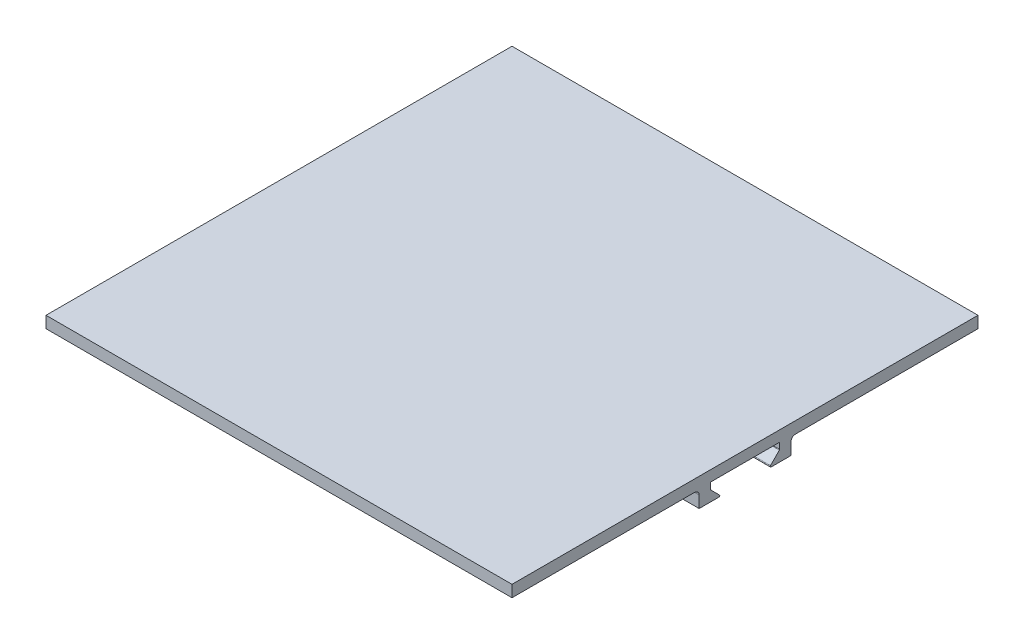
ISO-10303-21;
HEADER;
FILE_DESCRIPTION(('STEP AP214'),'2;1');
FILE_NAME('part.step','',(''),(''),'','','');
FILE_SCHEMA(('AUTOMOTIVE_DESIGN { 1 0 10303 214 1 1 1 1 }'));
ENDSEC;
DATA;
#1=APPLICATION_CONTEXT('core data for automotive mechanical design processes');
#2=APPLICATION_PROTOCOL_DEFINITION('international standard','automotive_design',2000,#1);
#3=PRODUCT_CONTEXT('',#1,'mechanical');
#4=PRODUCT('Part','Part','',(#3));
#5=PRODUCT_RELATED_PRODUCT_CATEGORY('part','',(#4));
#6=PRODUCT_DEFINITION_FORMATION('','',#4);
#7=PRODUCT_DEFINITION_CONTEXT('part definition',#1,'design');
#8=PRODUCT_DEFINITION('design','',#6,#7);
#9=PRODUCT_DEFINITION_SHAPE('','',#8);
#10=(LENGTH_UNIT() NAMED_UNIT(*) SI_UNIT(.MILLI.,.METRE.));
#11=(NAMED_UNIT(*) PLANE_ANGLE_UNIT() SI_UNIT($,.RADIAN.));
#12=(NAMED_UNIT(*) SI_UNIT($,.STERADIAN.) SOLID_ANGLE_UNIT());
#13=UNCERTAINTY_MEASURE_WITH_UNIT(LENGTH_MEASURE(1.E-05),#10,'distance_accuracy_value','');
#14=(GEOMETRIC_REPRESENTATION_CONTEXT(3) GLOBAL_UNCERTAINTY_ASSIGNED_CONTEXT((#13)) GLOBAL_UNIT_ASSIGNED_CONTEXT((#10,
#11,#12)) REPRESENTATION_CONTEXT('',''));
#15=CARTESIAN_POINT('',(0.,0.,0.));
#16=DIRECTION('',(0.,0.,1.));
#17=DIRECTION('',(1.,0.,0.));
#18=AXIS2_PLACEMENT_3D('',#15,#16,#17);
#19=CARTESIAN_POINT('',(127.,6.35,-127.));
#20=DIRECTION('',(-1.,0.,0.));
#21=DIRECTION('',(0.,0.,1.));
#22=AXIS2_PLACEMENT_3D('',#19,#20,#21);
#23=PLANE('',#22);
#24=DIRECTION('',(0.,0.,-1.));
#25=VECTOR('',#24,1.);
#26=CARTESIAN_POINT('',(127.,-8.89,25.));
#27=LINE('',#26,#25);
#28=CARTESIAN_POINT('',(127.,-8.89,25.));
#29=VERTEX_POINT('',#28);
#30=CARTESIAN_POINT('',(127.,-8.89,14.2546810586205));
#31=VERTEX_POINT('',#30);
#32=EDGE_CURVE('E218',#29,#31,#27,.T.);
#33=ORIENTED_EDGE('',*,*,#32,.T.);
#34=CARTESIAN_POINT('',(127.,-8.39,14.2546810586205));
#35=DIRECTION('',(-1.,0.,0.));
#36=DIRECTION('',(0.,0.,1.));
#37=AXIS2_PLACEMENT_3D('',#34,#35,#36);
#38=CIRCLE('',#37,0.5);
#39=CARTESIAN_POINT('',(127.,-8.03644660940672,13.9011276680272));
#40=VERTEX_POINT('',#39);
#41=EDGE_CURVE('E313',#31,#40,#38,.F.);
#42=ORIENTED_EDGE('',*,*,#41,.T.);
#43=DIRECTION('',(0.,-0.707106781186547,-0.707106781186548));
#44=VECTOR('',#43,1.);
#45=CARTESIAN_POINT('',(127.,-71.293787138717,-49.3562128612831));
#46=LINE('',#45,#44);
#47=CARTESIAN_POINT('',(127.,-3.19426197667087,18.7433123007631));
#48=VERTEX_POINT('',#47);
#49=EDGE_CURVE('E201',#48,#40,#46,.T.);
#50=ORIENTED_EDGE('',*,*,#49,.F.);
#51=CARTESIAN_POINT('',(127.,-2.84070858607759,18.3897589101698));
#52=DIRECTION('',(-1.,0.,0.));
#53=DIRECTION('',(0.,0.,1.));
#54=AXIS2_PLACEMENT_3D('',#51,#52,#53);
#55=CIRCLE('',#54,0.5);
#56=CARTESIAN_POINT('',(127.,-2.84070858607759,18.8897589101698));
#57=VERTEX_POINT('',#56);
#58=EDGE_CURVE('E295',#48,#57,#55,.T.);
#59=ORIENTED_EDGE('',*,*,#58,.T.);
#60=DIRECTION('',(0.,-1.,0.));
#61=VECTOR('',#60,1.);
#62=CARTESIAN_POINT('',(127.,6.35,18.8897589101698));
#63=LINE('',#62,#61);
#64=CARTESIAN_POINT('',(127.,0.491000000000111,18.8897589101698));
#65=VERTEX_POINT('',#64);
#66=EDGE_CURVE('E204',#65,#57,#63,.T.);
#67=ORIENTED_EDGE('',*,*,#66,.F.);
#68=DIRECTION('',(0.,0.,1.));
#69=VECTOR('',#68,1.);
#70=CARTESIAN_POINT('',(127.,0.49100000000011,-127.));
#71=LINE('',#70,#69);
#72=CARTESIAN_POINT('',(127.,0.491000000000111,-18.8722410898302));
#73=VERTEX_POINT('',#72);
#74=EDGE_CURVE('E175',#73,#65,#71,.T.);
#75=ORIENTED_EDGE('',*,*,#74,.F.);
#76=DIRECTION('',(0.,-1.,0.));
#77=VECTOR('',#76,1.);
#78=CARTESIAN_POINT('',(127.,6.35,-18.8722410898302));
#79=LINE('',#78,#77);
#80=CARTESIAN_POINT('',(127.,-2.84070858607759,-18.8722410898302));
#81=VERTEX_POINT('',#80);
#82=EDGE_CURVE('E207',#73,#81,#79,.T.);
#83=ORIENTED_EDGE('',*,*,#82,.T.);
#84=CARTESIAN_POINT('',(127.,-2.84070858607759,-18.3722410898302));
#85=DIRECTION('',(-1.,0.,0.));
#86=DIRECTION('',(0.,0.,1.));
#87=AXIS2_PLACEMENT_3D('',#84,#85,#86);
#88=CIRCLE('',#87,0.5);
#89=CARTESIAN_POINT('',(127.,-3.19426197667087,-18.7257944804235));
#90=VERTEX_POINT('',#89);
#91=EDGE_CURVE('E290',#81,#90,#88,.T.);
#92=ORIENTED_EDGE('',*,*,#91,.T.);
#93=DIRECTION('',(0.,-0.707106781186548,0.707106781186548));
#94=VECTOR('',#93,1.);
#95=CARTESIAN_POINT('',(127.,55.7149717714528,-77.6350282285472));
#96=LINE('',#95,#94);
#97=CARTESIAN_POINT('',(127.,-8.03644660940673,-13.8836098476876));
#98=VERTEX_POINT('',#97);
#99=EDGE_CURVE('E197',#90,#98,#96,.T.);
#100=ORIENTED_EDGE('',*,*,#99,.T.);
#101=CARTESIAN_POINT('',(127.,-8.39,-14.2371632382809));
#102=DIRECTION('',(-1.,0.,0.));
#103=DIRECTION('',(0.,0.,1.));
#104=AXIS2_PLACEMENT_3D('',#101,#102,#103);
#105=CIRCLE('',#104,0.5);
#106=CARTESIAN_POINT('',(127.,-8.89,-14.2371632382809));
#107=VERTEX_POINT('',#106);
#108=EDGE_CURVE('E315',#98,#107,#105,.F.);
#109=ORIENTED_EDGE('',*,*,#108,.T.);
#110=CARTESIAN_POINT('',(127.,-8.89,-25.));
#111=VERTEX_POINT('',#110);
#112=EDGE_CURVE('E217',#107,#111,#27,.T.);
#113=ORIENTED_EDGE('',*,*,#112,.T.);
#114=DIRECTION('',(0.,1.,0.));
#115=VECTOR('',#114,1.);
#116=CARTESIAN_POINT('',(127.,-8.89,-25.));
#117=LINE('',#116,#115);
#118=CARTESIAN_POINT('',(127.,-2.54,-25.));
#119=VERTEX_POINT('',#118);
#120=EDGE_CURVE('E255',#111,#119,#117,.T.);
#121=ORIENTED_EDGE('',*,*,#120,.T.);
#122=CARTESIAN_POINT('',(127.,-2.54,-27.54));
#123=DIRECTION('',(-1.,0.,0.));
#124=DIRECTION('',(0.,0.,1.));
#125=AXIS2_PLACEMENT_3D('',#122,#123,#124);
#126=CIRCLE('',#125,2.54);
#127=CARTESIAN_POINT('',(127.,0.,-27.54));
#128=VERTEX_POINT('',#127);
#129=EDGE_CURVE('E268',#119,#128,#126,.T.);
#130=ORIENTED_EDGE('',*,*,#129,.T.);
#131=DIRECTION('',(0.,0.,-1.));
#132=VECTOR('',#131,1.);
#133=CARTESIAN_POINT('',(127.,0.,-127.));
#134=LINE('',#133,#132);
#135=CARTESIAN_POINT('',(127.,0.,-127.));
#136=VERTEX_POINT('',#135);
#137=EDGE_CURVE('E242',#128,#136,#134,.T.);
#138=ORIENTED_EDGE('',*,*,#137,.T.);
#139=DIRECTION('',(0.,-1.,0.));
#140=VECTOR('',#139,1.);
#141=CARTESIAN_POINT('',(127.,6.35,-127.));
#142=LINE('',#141,#140);
#143=CARTESIAN_POINT('',(127.,6.35,-127.));
#144=VERTEX_POINT('',#143);
#145=EDGE_CURVE('E249',#144,#136,#142,.T.);
#146=ORIENTED_EDGE('',*,*,#145,.F.);
#147=DIRECTION('',(0.,0.,-1.));
#148=VECTOR('',#147,1.);
#149=CARTESIAN_POINT('',(127.,6.35,-127.));
#150=LINE('',#149,#148);
#151=CARTESIAN_POINT('',(127.,6.35,127.));
#152=VERTEX_POINT('',#151);
#153=EDGE_CURVE('E225',#152,#144,#150,.T.);
#154=ORIENTED_EDGE('',*,*,#153,.F.);
#155=DIRECTION('',(0.,-1.,0.));
#156=VECTOR('',#155,1.);
#157=CARTESIAN_POINT('',(127.,6.35,127.));
#158=LINE('',#157,#156);
#159=CARTESIAN_POINT('',(127.,0.,127.));
#160=VERTEX_POINT('',#159);
#161=EDGE_CURVE('E235',#152,#160,#158,.T.);
#162=ORIENTED_EDGE('',*,*,#161,.T.);
#163=CARTESIAN_POINT('',(127.,0.,27.54));
#164=VERTEX_POINT('',#163);
#165=EDGE_CURVE('E246',#160,#164,#134,.T.);
#166=ORIENTED_EDGE('',*,*,#165,.T.);
#167=CARTESIAN_POINT('',(127.,-2.54,27.54));
#168=DIRECTION('',(-1.,0.,0.));
#169=DIRECTION('',(0.,0.,1.));
#170=AXIS2_PLACEMENT_3D('',#167,#168,#169);
#171=CIRCLE('',#170,2.54);
#172=CARTESIAN_POINT('',(127.,-2.54,25.));
#173=VERTEX_POINT('',#172);
#174=EDGE_CURVE('E40',#164,#173,#171,.T.);
#175=ORIENTED_EDGE('',*,*,#174,.T.);
#176=DIRECTION('',(0.,1.,0.));
#177=VECTOR('',#176,1.);
#178=CARTESIAN_POINT('',(127.,-8.89,25.));
#179=LINE('',#178,#177);
#180=EDGE_CURVE('E327',#29,#173,#179,.T.);
#181=ORIENTED_EDGE('',*,*,#180,.F.);
#182=EDGE_LOOP('',(#33,#42,#50,#59,#67,#75,#83,#92,#100,#109,#113,#121,#130,#138,#146,#154,#162,
#166,#175,#181));
#183=FACE_BOUND('',#182,.T.);
#184=ADVANCED_FACE('F32',(#183),#23,.F.);
#185=CARTESIAN_POINT('',(-127.,6.35,-127.));
#186=DIRECTION('',(1.,0.,0.));
#187=DIRECTION('',(0.,0.,-1.));
#188=AXIS2_PLACEMENT_3D('',#185,#186,#187);
#189=PLANE('',#188);
#190=DIRECTION('',(0.,-0.707106781186547,-0.707106781186548));
#191=VECTOR('',#190,1.);
#192=CARTESIAN_POINT('',(-127.,-3.04781536726414,18.8897589101698));
#193=LINE('',#192,#191);
#194=CARTESIAN_POINT('',(-127.,-3.19426197667086,18.7433123007631));
#195=VERTEX_POINT('',#194);
#196=CARTESIAN_POINT('',(-127.,-8.03644660940673,13.9011276680272));
#197=VERTEX_POINT('',#196);
#198=EDGE_CURVE('E188',#195,#197,#193,.T.);
#199=ORIENTED_EDGE('',*,*,#198,.T.);
#200=CARTESIAN_POINT('',(-127.,-8.39,14.2546810586205));
#201=DIRECTION('',(1.,0.,0.));
#202=DIRECTION('',(0.,0.,-1.));
#203=AXIS2_PLACEMENT_3D('',#200,#201,#202);
#204=CIRCLE('',#203,0.5);
#205=CARTESIAN_POINT('',(-127.,-8.89,14.2546810586205));
#206=VERTEX_POINT('',#205);
#207=EDGE_CURVE('E309',#197,#206,#204,.F.);
#208=ORIENTED_EDGE('',*,*,#207,.T.);
#209=DIRECTION('',(0.,0.,-1.));
#210=VECTOR('',#209,1.);
#211=CARTESIAN_POINT('',(-127.,-8.89,25.));
#212=LINE('',#211,#210);
#213=CARTESIAN_POINT('',(-127.,-8.89,25.));
#214=VERTEX_POINT('',#213);
#215=EDGE_CURVE('E211',#214,#206,#212,.T.);
#216=ORIENTED_EDGE('',*,*,#215,.F.);
#217=DIRECTION('',(0.,1.,0.));
#218=VECTOR('',#217,1.);
#219=CARTESIAN_POINT('',(-127.,-8.89,25.));
#220=LINE('',#219,#218);
#221=CARTESIAN_POINT('',(-127.,-2.54,25.));
#222=VERTEX_POINT('',#221);
#223=EDGE_CURVE('E224',#214,#222,#220,.T.);
#224=ORIENTED_EDGE('',*,*,#223,.T.);
#225=CARTESIAN_POINT('',(-127.,-2.54,27.54));
#226=DIRECTION('',(1.,0.,0.));
#227=DIRECTION('',(0.,0.,-1.));
#228=AXIS2_PLACEMENT_3D('',#225,#226,#227);
#229=CIRCLE('',#228,2.54);
#230=CARTESIAN_POINT('',(-127.,0.,27.54));
#231=VERTEX_POINT('',#230);
#232=EDGE_CURVE('E11',#222,#231,#229,.T.);
#233=ORIENTED_EDGE('',*,*,#232,.T.);
#234=DIRECTION('',(0.,0.,1.));
#235=VECTOR('',#234,1.);
#236=CARTESIAN_POINT('',(-127.,0.,-127.));
#237=LINE('',#236,#235);
#238=CARTESIAN_POINT('',(-127.,0.,127.));
#239=VERTEX_POINT('',#238);
#240=EDGE_CURVE('E254',#231,#239,#237,.T.);
#241=ORIENTED_EDGE('',*,*,#240,.T.);
#242=DIRECTION('',(0.,-1.,0.));
#243=VECTOR('',#242,1.);
#244=CARTESIAN_POINT('',(-127.,6.35,127.));
#245=LINE('',#244,#243);
#246=CARTESIAN_POINT('',(-127.,6.35,127.));
#247=VERTEX_POINT('',#246);
#248=EDGE_CURVE('E350',#247,#239,#245,.T.);
#249=ORIENTED_EDGE('',*,*,#248,.F.);
#250=DIRECTION('',(0.,0.,1.));
#251=VECTOR('',#250,1.);
#252=CARTESIAN_POINT('',(-127.,6.35,-127.));
#253=LINE('',#252,#251);
#254=CARTESIAN_POINT('',(-127.,6.35,-127.));
#255=VERTEX_POINT('',#254);
#256=EDGE_CURVE('E231',#255,#247,#253,.T.);
#257=ORIENTED_EDGE('',*,*,#256,.F.);
#258=DIRECTION('',(0.,-1.,0.));
#259=VECTOR('',#258,1.);
#260=CARTESIAN_POINT('',(-127.,6.35,-127.));
#261=LINE('',#260,#259);
#262=CARTESIAN_POINT('',(-127.,0.,-127.));
#263=VERTEX_POINT('',#262);
#264=EDGE_CURVE('E352',#255,#263,#261,.T.);
#265=ORIENTED_EDGE('',*,*,#264,.T.);
#266=CARTESIAN_POINT('',(-127.,0.,-27.54));
#267=VERTEX_POINT('',#266);
#268=EDGE_CURVE('E251',#263,#267,#237,.T.);
#269=ORIENTED_EDGE('',*,*,#268,.T.);
#270=CARTESIAN_POINT('',(-127.,-2.54,-27.54));
#271=DIRECTION('',(1.,0.,0.));
#272=DIRECTION('',(0.,0.,-1.));
#273=AXIS2_PLACEMENT_3D('',#270,#271,#272);
#274=CIRCLE('',#273,2.54);
#275=CARTESIAN_POINT('',(-127.,-2.54,-25.));
#276=VERTEX_POINT('',#275);
#277=EDGE_CURVE('E270',#267,#276,#274,.T.);
#278=ORIENTED_EDGE('',*,*,#277,.T.);
#279=DIRECTION('',(0.,1.,0.));
#280=VECTOR('',#279,1.);
#281=CARTESIAN_POINT('',(-127.,-8.89,-25.));
#282=LINE('',#281,#280);
#283=CARTESIAN_POINT('',(-127.,-8.89,-25.));
#284=VERTEX_POINT('',#283);
#285=EDGE_CURVE('E275',#284,#276,#282,.T.);
#286=ORIENTED_EDGE('',*,*,#285,.F.);
#287=CARTESIAN_POINT('',(-127.,-8.89,-14.2371632382809));
#288=VERTEX_POINT('',#287);
#289=EDGE_CURVE('E210',#288,#284,#212,.T.);
#290=ORIENTED_EDGE('',*,*,#289,.F.);
#291=CARTESIAN_POINT('',(-127.,-8.39,-14.2371632382809));
#292=DIRECTION('',(1.,0.,0.));
#293=DIRECTION('',(0.,0.,-1.));
#294=AXIS2_PLACEMENT_3D('',#291,#292,#293);
#295=CIRCLE('',#294,0.5);
#296=CARTESIAN_POINT('',(-127.,-8.03644660940673,-13.8836098476876));
#297=VERTEX_POINT('',#296);
#298=EDGE_CURVE('E311',#288,#297,#295,.F.);
#299=ORIENTED_EDGE('',*,*,#298,.T.);
#300=DIRECTION('',(0.,-0.707106781186548,0.707106781186548));
#301=VECTOR('',#300,1.);
#302=CARTESIAN_POINT('',(-127.,-3.04781536726413,-18.8722410898302));
#303=LINE('',#302,#301);
#304=CARTESIAN_POINT('',(-127.,-3.19426197667086,-18.7257944804235));
#305=VERTEX_POINT('',#304);
#306=EDGE_CURVE('E568',#305,#297,#303,.T.);
#307=ORIENTED_EDGE('',*,*,#306,.F.);
#308=CARTESIAN_POINT('',(-127.,-2.84070858607759,-18.3722410898302));
#309=DIRECTION('',(1.,0.,0.));
#310=DIRECTION('',(0.,0.,-1.));
#311=AXIS2_PLACEMENT_3D('',#308,#309,#310);
#312=CIRCLE('',#311,0.5);
#313=CARTESIAN_POINT('',(-127.,-2.84070858607759,-18.8722410898302));
#314=VERTEX_POINT('',#313);
#315=EDGE_CURVE('E291',#305,#314,#312,.T.);
#316=ORIENTED_EDGE('',*,*,#315,.T.);
#317=DIRECTION('',(0.,-1.,0.));
#318=VECTOR('',#317,1.);
#319=CARTESIAN_POINT('',(-127.,0.491000000000111,-18.8722410898302));
#320=LINE('',#319,#318);
#321=CARTESIAN_POINT('',(-127.,0.491000000000111,-18.8722410898302));
#322=VERTEX_POINT('',#321);
#323=EDGE_CURVE('E193',#322,#314,#320,.T.);
#324=ORIENTED_EDGE('',*,*,#323,.F.);
#325=DIRECTION('',(0.,0.,1.));
#326=VECTOR('',#325,1.);
#327=CARTESIAN_POINT('',(-127.,0.491000000000111,-18.8722410898302));
#328=LINE('',#327,#326);
#329=CARTESIAN_POINT('',(-127.,0.491000000000111,18.8897589101698));
#330=VERTEX_POINT('',#329);
#331=EDGE_CURVE('E172',#322,#330,#328,.T.);
#332=ORIENTED_EDGE('',*,*,#331,.T.);
#333=DIRECTION('',(0.,-1.,0.));
#334=VECTOR('',#333,1.);
#335=CARTESIAN_POINT('',(-127.,0.491000000000111,18.8897589101698));
#336=LINE('',#335,#334);
#337=CARTESIAN_POINT('',(-127.,-2.84070858607759,18.8897589101698));
#338=VERTEX_POINT('',#337);
#339=EDGE_CURVE('E183',#330,#338,#336,.T.);
#340=ORIENTED_EDGE('',*,*,#339,.T.);
#341=CARTESIAN_POINT('',(-127.,-2.84070858607759,18.3897589101698));
#342=DIRECTION('',(1.,0.,0.));
#343=DIRECTION('',(0.,0.,-1.));
#344=AXIS2_PLACEMENT_3D('',#341,#342,#343);
#345=CIRCLE('',#344,0.5);
#346=EDGE_CURVE('E297',#338,#195,#345,.T.);
#347=ORIENTED_EDGE('',*,*,#346,.T.);
#348=EDGE_LOOP('',(#199,#208,#216,#224,#233,#241,#249,#257,#265,#269,#278,#286,#290,#299,#307,
#316,#324,#332,#340,#347));
#349=FACE_BOUND('',#348,.T.);
#350=ADVANCED_FACE('F191',(#349),#189,.F.);
#351=CARTESIAN_POINT('',(0.,-8.89,0.));
#352=DIRECTION('',(0.,-1.,0.));
#353=DIRECTION('',(0.,0.,-1.));
#354=AXIS2_PLACEMENT_3D('',#351,#352,#353);
#355=PLANE('',#354);
#356=ORIENTED_EDGE('',*,*,#215,.T.);
#357=DIRECTION('',(1.,0.,0.));
#358=VECTOR('',#357,1.);
#359=CARTESIAN_POINT('',(0.,-8.89,14.2546810586205));
#360=LINE('',#359,#358);
#361=EDGE_CURVE('E317',#206,#31,#360,.T.);
#362=ORIENTED_EDGE('',*,*,#361,.T.);
#363=ORIENTED_EDGE('',*,*,#32,.F.);
#364=DIRECTION('',(1.,0.,0.));
#365=VECTOR('',#364,1.);
#366=CARTESIAN_POINT('',(-127.,-8.89,25.));
#367=LINE('',#366,#365);
#368=EDGE_CURVE('E221',#214,#29,#367,.T.);
#369=ORIENTED_EDGE('',*,*,#368,.F.);
#370=EDGE_LOOP('',(#356,#362,#363,#369));
#371=FACE_BOUND('',#370,.T.);
#372=ADVANCED_FACE('F364',(#371),#355,.T.);
#373=CARTESIAN_POINT('',(0.,0.,0.));
#374=DIRECTION('',(0.,1.,0.));
#375=DIRECTION('',(0.,0.,1.));
#376=AXIS2_PLACEMENT_3D('',#373,#374,#375);
#377=PLANE('',#376);
#378=ORIENTED_EDGE('',*,*,#137,.F.);
#379=DIRECTION('',(1.,0.,0.));
#380=VECTOR('',#379,1.);
#381=CARTESIAN_POINT('',(-127.,0.,-27.54));
#382=LINE('',#381,#380);
#383=EDGE_CURVE('E263',#128,#267,#382,.F.);
#384=ORIENTED_EDGE('',*,*,#383,.T.);
#385=ORIENTED_EDGE('',*,*,#268,.F.);
#386=DIRECTION('',(-1.,0.,0.));
#387=VECTOR('',#386,1.);
#388=CARTESIAN_POINT('',(-127.,0.,-127.));
#389=LINE('',#388,#387);
#390=EDGE_CURVE('E238',#136,#263,#389,.T.);
#391=ORIENTED_EDGE('',*,*,#390,.F.);
#392=EDGE_LOOP('',(#378,#384,#385,#391));
#393=FACE_BOUND('',#392,.T.);
#394=ADVANCED_FACE('F362',(#393),#377,.F.);
#395=CARTESIAN_POINT('',(-127.,6.35,-127.));
#396=DIRECTION('',(0.,0.,1.));
#397=DIRECTION('',(1.,0.,0.));
#398=AXIS2_PLACEMENT_3D('',#395,#396,#397);
#399=PLANE('',#398);
#400=ORIENTED_EDGE('',*,*,#390,.T.);
#401=ORIENTED_EDGE('',*,*,#264,.F.);
#402=DIRECTION('',(-1.,0.,0.));
#403=VECTOR('',#402,1.);
#404=CARTESIAN_POINT('',(-127.,6.35,-127.));
#405=LINE('',#404,#403);
#406=EDGE_CURVE('E228',#144,#255,#405,.T.);
#407=ORIENTED_EDGE('',*,*,#406,.F.);
#408=ORIENTED_EDGE('',*,*,#145,.T.);
#409=EDGE_LOOP('',(#400,#401,#407,#408));
#410=FACE_BOUND('',#409,.T.);
#411=ADVANCED_FACE('F358',(#410),#399,.F.);
#412=CARTESIAN_POINT('',(-127.,6.35,127.));
#413=DIRECTION('',(0.,0.,-1.));
#414=DIRECTION('',(-1.,0.,0.));
#415=AXIS2_PLACEMENT_3D('',#412,#413,#414);
#416=PLANE('',#415);
#417=DIRECTION('',(1.,0.,0.));
#418=VECTOR('',#417,1.);
#419=CARTESIAN_POINT('',(-127.,0.,127.));
#420=LINE('',#419,#418);
#421=EDGE_CURVE('E229',#239,#160,#420,.T.);
#422=ORIENTED_EDGE('',*,*,#421,.T.);
#423=ORIENTED_EDGE('',*,*,#161,.F.);
#424=DIRECTION('',(1.,0.,0.));
#425=VECTOR('',#424,1.);
#426=CARTESIAN_POINT('',(-127.,6.35,127.));
#427=LINE('',#426,#425);
#428=EDGE_CURVE('E233',#247,#152,#427,.T.);
#429=ORIENTED_EDGE('',*,*,#428,.F.);
#430=ORIENTED_EDGE('',*,*,#248,.T.);
#431=EDGE_LOOP('',(#422,#423,#429,#430));
#432=FACE_BOUND('',#431,.T.);
#433=ADVANCED_FACE('F370',(#432),#416,.F.);
#434=CARTESIAN_POINT('',(0.,6.35,0.));
#435=DIRECTION('',(0.,1.,0.));
#436=DIRECTION('',(0.,0.,1.));
#437=AXIS2_PLACEMENT_3D('',#434,#435,#436);
#438=PLANE('',#437);
#439=ORIENTED_EDGE('',*,*,#153,.T.);
#440=ORIENTED_EDGE('',*,*,#406,.T.);
#441=ORIENTED_EDGE('',*,*,#256,.T.);
#442=ORIENTED_EDGE('',*,*,#428,.T.);
#443=EDGE_LOOP('',(#439,#440,#441,#442));
#444=FACE_BOUND('',#443,.T.);
#445=ADVANCED_FACE('F378',(#444),#438,.T.);
#446=ORIENTED_EDGE('',*,*,#240,.F.);
#447=DIRECTION('',(1.,0.,0.));
#448=VECTOR('',#447,1.);
#449=CARTESIAN_POINT('',(0.,0.,27.54));
#450=LINE('',#449,#448);
#451=EDGE_CURVE('E264',#231,#164,#450,.T.);
#452=ORIENTED_EDGE('',*,*,#451,.T.);
#453=ORIENTED_EDGE('',*,*,#165,.F.);
#454=ORIENTED_EDGE('',*,*,#421,.F.);
#455=EDGE_LOOP('',(#446,#452,#453,#454));
#456=FACE_BOUND('',#455,.T.);
#457=ADVANCED_FACE('F342',(#456),#377,.F.);
#458=CARTESIAN_POINT('',(-127.,-8.89,-25.));
#459=DIRECTION('',(0.,0.,1.));
#460=DIRECTION('',(1.,0.,0.));
#461=AXIS2_PLACEMENT_3D('',#458,#459,#460);
#462=PLANE('',#461);
#463=ORIENTED_EDGE('',*,*,#285,.T.);
#464=DIRECTION('',(1.,0.,0.));
#465=VECTOR('',#464,1.);
#466=CARTESIAN_POINT('',(127.,-2.54,-25.));
#467=LINE('',#466,#465);
#468=EDGE_CURVE('E286',#276,#119,#467,.T.);
#469=ORIENTED_EDGE('',*,*,#468,.T.);
#470=ORIENTED_EDGE('',*,*,#120,.F.);
#471=DIRECTION('',(1.,0.,0.));
#472=VECTOR('',#471,1.);
#473=CARTESIAN_POINT('',(-127.,-8.89,-25.));
#474=LINE('',#473,#472);
#475=EDGE_CURVE('E214',#284,#111,#474,.T.);
#476=ORIENTED_EDGE('',*,*,#475,.F.);
#477=EDGE_LOOP('',(#463,#469,#470,#476));
#478=FACE_BOUND('',#477,.T.);
#479=ADVANCED_FACE('F284',(#478),#462,.F.);
#480=CARTESIAN_POINT('',(-127.,-8.89,25.));
#481=DIRECTION('',(0.,0.,1.));
#482=DIRECTION('',(1.,0.,0.));
#483=AXIS2_PLACEMENT_3D('',#480,#481,#482);
#484=PLANE('',#483);
#485=ORIENTED_EDGE('',*,*,#180,.T.);
#486=DIRECTION('',(1.,0.,0.));
#487=VECTOR('',#486,1.);
#488=CARTESIAN_POINT('',(-127.,-2.54,25.));
#489=LINE('',#488,#487);
#490=EDGE_CURVE('E53',#173,#222,#489,.F.);
#491=ORIENTED_EDGE('',*,*,#490,.T.);
#492=ORIENTED_EDGE('',*,*,#223,.F.);
#493=ORIENTED_EDGE('',*,*,#368,.T.);
#494=EDGE_LOOP('',(#485,#491,#492,#493));
#495=FACE_BOUND('',#494,.T.);
#496=ADVANCED_FACE('F418',(#495),#484,.T.);
#497=ORIENTED_EDGE('',*,*,#112,.F.);
#498=DIRECTION('',(1.,0.,0.));
#499=VECTOR('',#498,1.);
#500=CARTESIAN_POINT('',(-127.,-8.89,-14.2371632382809));
#501=LINE('',#500,#499);
#502=EDGE_CURVE('E301',#107,#288,#501,.F.);
#503=ORIENTED_EDGE('',*,*,#502,.T.);
#504=ORIENTED_EDGE('',*,*,#289,.T.);
#505=ORIENTED_EDGE('',*,*,#475,.T.);
#506=EDGE_LOOP('',(#497,#503,#504,#505));
#507=FACE_BOUND('',#506,.T.);
#508=ADVANCED_FACE('F374',(#507),#355,.T.);
#509=CARTESIAN_POINT('',(127.00005,0.491000000000111,-18.8722410898302));
#510=DIRECTION('',(0.,0.,-1.));
#511=DIRECTION('',(-1.,0.,0.));
#512=AXIS2_PLACEMENT_3D('',#509,#510,#511);
#513=PLANE('',#512);
#514=ORIENTED_EDGE('',*,*,#323,.T.);
#515=DIRECTION('',(-1.,0.,0.));
#516=VECTOR('',#515,1.);
#517=CARTESIAN_POINT('',(127.,-2.84070858607759,-18.8722410898302));
#518=LINE('',#517,#516);
#519=EDGE_CURVE('E299',#314,#81,#518,.F.);
#520=ORIENTED_EDGE('',*,*,#519,.T.);
#521=ORIENTED_EDGE('',*,*,#82,.F.);
#522=DIRECTION('',(-1.,0.,0.));
#523=VECTOR('',#522,1.);
#524=CARTESIAN_POINT('',(127.00005,0.491000000000111,-18.8722410898302));
#525=LINE('',#524,#523);
#526=EDGE_CURVE('E179',#73,#322,#525,.T.);
#527=ORIENTED_EDGE('',*,*,#526,.T.);
#528=EDGE_LOOP('',(#514,#520,#521,#527));
#529=FACE_BOUND('',#528,.T.);
#530=ADVANCED_FACE('F514',(#529),#513,.F.);
#531=CARTESIAN_POINT('',(127.00005,0.491000000000111,-18.8722410898302));
#532=DIRECTION('',(0.,-1.,0.));
#533=DIRECTION('',(0.,0.,-1.));
#534=AXIS2_PLACEMENT_3D('',#531,#532,#533);
#535=PLANE('',#534);
#536=ORIENTED_EDGE('',*,*,#74,.T.);
#537=DIRECTION('',(-1.,0.,0.));
#538=VECTOR('',#537,1.);
#539=CARTESIAN_POINT('',(127.00005,0.491000000000111,18.8897589101698));
#540=LINE('',#539,#538);
#541=EDGE_CURVE('E167',#65,#330,#540,.T.);
#542=ORIENTED_EDGE('',*,*,#541,.T.);
#543=ORIENTED_EDGE('',*,*,#331,.F.);
#544=ORIENTED_EDGE('',*,*,#526,.F.);
#545=EDGE_LOOP('',(#536,#542,#543,#544));
#546=FACE_BOUND('',#545,.T.);
#547=ADVANCED_FACE('F169',(#546),#535,.T.);
#548=CARTESIAN_POINT('',(127.00005,0.491000000000111,18.8897589101698));
#549=DIRECTION('',(0.,0.,-1.));
#550=DIRECTION('',(-1.,0.,0.));
#551=AXIS2_PLACEMENT_3D('',#548,#549,#550);
#552=PLANE('',#551);
#553=ORIENTED_EDGE('',*,*,#66,.T.);
#554=DIRECTION('',(-1.,0.,0.));
#555=VECTOR('',#554,1.);
#556=CARTESIAN_POINT('',(-127.,-2.84070858607759,18.8897589101698));
#557=LINE('',#556,#555);
#558=EDGE_CURVE('E186',#57,#338,#557,.T.);
#559=ORIENTED_EDGE('',*,*,#558,.T.);
#560=ORIENTED_EDGE('',*,*,#339,.F.);
#561=ORIENTED_EDGE('',*,*,#541,.F.);
#562=EDGE_LOOP('',(#553,#559,#560,#561));
#563=FACE_BOUND('',#562,.T.);
#564=ADVANCED_FACE('F184',(#563),#552,.T.);
#565=CARTESIAN_POINT('',(127.00005,-3.04781536726414,18.8897589101698));
#566=DIRECTION('',(0.,0.707106781186548,-0.707106781186547));
#567=DIRECTION('',(0.,0.707106781186547,0.707106781186548));
#568=AXIS2_PLACEMENT_3D('',#565,#566,#567);
#569=PLANE('',#568);
#570=ORIENTED_EDGE('',*,*,#198,.F.);
#571=DIRECTION('',(-1.,0.,0.));
#572=VECTOR('',#571,1.);
#573=CARTESIAN_POINT('',(127.,-3.19426197667086,18.7433123007631));
#574=LINE('',#573,#572);
#575=EDGE_CURVE('E320',#195,#48,#574,.F.);
#576=ORIENTED_EDGE('',*,*,#575,.T.);
#577=ORIENTED_EDGE('',*,*,#49,.T.);
#578=DIRECTION('',(1.,0.,0.));
#579=VECTOR('',#578,1.);
#580=CARTESIAN_POINT('',(127.00005,-8.03644660940673,13.9011276680272));
#581=LINE('',#580,#579);
#582=EDGE_CURVE('E322',#40,#197,#581,.F.);
#583=ORIENTED_EDGE('',*,*,#582,.T.);
#584=EDGE_LOOP('',(#570,#576,#577,#583));
#585=FACE_BOUND('',#584,.T.);
#586=ADVANCED_FACE('F489',(#585),#569,.T.);
#587=CARTESIAN_POINT('',(127.00005,-3.04781536726413,-18.8722410898302));
#588=DIRECTION('',(0.,-0.707106781186547,-0.707106781186547));
#589=DIRECTION('',(0.,0.707106781186548,-0.707106781186548));
#590=AXIS2_PLACEMENT_3D('',#587,#588,#589);
#591=PLANE('',#590);
#592=ORIENTED_EDGE('',*,*,#306,.T.);
#593=DIRECTION('',(1.,0.,0.));
#594=VECTOR('',#593,1.);
#595=CARTESIAN_POINT('',(127.,-8.03644660940673,-13.8836098476877));
#596=LINE('',#595,#594);
#597=EDGE_CURVE('E303',#297,#98,#596,.T.);
#598=ORIENTED_EDGE('',*,*,#597,.T.);
#599=ORIENTED_EDGE('',*,*,#99,.F.);
#600=DIRECTION('',(-1.,0.,0.));
#601=VECTOR('',#600,1.);
#602=CARTESIAN_POINT('',(-127.,-3.19426197667086,-18.7257944804235));
#603=LINE('',#602,#601);
#604=EDGE_CURVE('E306',#90,#305,#603,.T.);
#605=ORIENTED_EDGE('',*,*,#604,.T.);
#606=EDGE_LOOP('',(#592,#598,#599,#605));
#607=FACE_BOUND('',#606,.T.);
#608=ADVANCED_FACE('F390',(#607),#591,.F.);
#609=CARTESIAN_POINT('',(127.00005,-2.84070858607759,18.3897589101698));
#610=DIRECTION('',(1.,0.,0.));
#611=DIRECTION('',(0.,0.,-1.));
#612=AXIS2_PLACEMENT_3D('',#609,#610,#611);
#613=CYLINDRICAL_SURFACE('',#612,0.5);
#614=ORIENTED_EDGE('',*,*,#58,.F.);
#615=ORIENTED_EDGE('',*,*,#575,.F.);
#616=ORIENTED_EDGE('',*,*,#346,.F.);
#617=ORIENTED_EDGE('',*,*,#558,.F.);
#618=EDGE_LOOP('',(#614,#615,#616,#617));
#619=FACE_BOUND('',#618,.T.);
#620=ADVANCED_FACE('F386',(#619),#613,.F.);
#621=CARTESIAN_POINT('',(0.,-8.39,14.2546810586205));
#622=DIRECTION('',(1.,0.,0.));
#623=DIRECTION('',(0.,0.,-1.));
#624=AXIS2_PLACEMENT_3D('',#621,#622,#623);
#625=CYLINDRICAL_SURFACE('',#624,0.5);
#626=ORIENTED_EDGE('',*,*,#207,.F.);
#627=ORIENTED_EDGE('',*,*,#582,.F.);
#628=ORIENTED_EDGE('',*,*,#41,.F.);
#629=ORIENTED_EDGE('',*,*,#361,.F.);
#630=EDGE_LOOP('',(#626,#627,#628,#629));
#631=FACE_BOUND('',#630,.T.);
#632=ADVANCED_FACE('F389',(#631),#625,.T.);
#633=CARTESIAN_POINT('',(127.00005,-8.39,-14.2371632382809));
#634=DIRECTION('',(-1.,0.,0.));
#635=DIRECTION('',(0.,0.,1.));
#636=AXIS2_PLACEMENT_3D('',#633,#634,#635);
#637=CYLINDRICAL_SURFACE('',#636,0.5);
#638=ORIENTED_EDGE('',*,*,#298,.F.);
#639=ORIENTED_EDGE('',*,*,#502,.F.);
#640=ORIENTED_EDGE('',*,*,#108,.F.);
#641=ORIENTED_EDGE('',*,*,#597,.F.);
#642=EDGE_LOOP('',(#638,#639,#640,#641));
#643=FACE_BOUND('',#642,.T.);
#644=ADVANCED_FACE('F394',(#643),#637,.T.);
#645=CARTESIAN_POINT('',(127.00005,-2.84070858607759,-18.3722410898302));
#646=DIRECTION('',(1.,0.,0.));
#647=DIRECTION('',(0.,0.,-1.));
#648=AXIS2_PLACEMENT_3D('',#645,#646,#647);
#649=CYLINDRICAL_SURFACE('',#648,0.5);
#650=ORIENTED_EDGE('',*,*,#91,.F.);
#651=ORIENTED_EDGE('',*,*,#519,.F.);
#652=ORIENTED_EDGE('',*,*,#315,.F.);
#653=ORIENTED_EDGE('',*,*,#604,.F.);
#654=EDGE_LOOP('',(#650,#651,#652,#653));
#655=FACE_BOUND('',#654,.T.);
#656=ADVANCED_FACE('F398',(#655),#649,.F.);
#657=CARTESIAN_POINT('',(-127.,-2.54,-27.54));
#658=DIRECTION('',(-1.,0.,0.));
#659=DIRECTION('',(0.,0.,1.));
#660=AXIS2_PLACEMENT_3D('',#657,#658,#659);
#661=CYLINDRICAL_SURFACE('',#660,2.54);
#662=ORIENTED_EDGE('',*,*,#277,.F.);
#663=ORIENTED_EDGE('',*,*,#383,.F.);
#664=ORIENTED_EDGE('',*,*,#129,.F.);
#665=ORIENTED_EDGE('',*,*,#468,.F.);
#666=EDGE_LOOP('',(#662,#663,#664,#665));
#667=FACE_BOUND('',#666,.T.);
#668=ADVANCED_FACE('F289',(#667),#661,.F.);
#669=CARTESIAN_POINT('',(0.,-2.54,27.54));
#670=DIRECTION('',(1.,0.,0.));
#671=DIRECTION('',(0.,0.,-1.));
#672=AXIS2_PLACEMENT_3D('',#669,#670,#671);
#673=CYLINDRICAL_SURFACE('',#672,2.54);
#674=ORIENTED_EDGE('',*,*,#232,.F.);
#675=ORIENTED_EDGE('',*,*,#490,.F.);
#676=ORIENTED_EDGE('',*,*,#174,.F.);
#677=ORIENTED_EDGE('',*,*,#451,.F.);
#678=EDGE_LOOP('',(#674,#675,#676,#677));
#679=FACE_BOUND('',#678,.T.);
#680=ADVANCED_FACE('F34',(#679),#673,.F.);
#681=CLOSED_SHELL('',(#184,#350,#372,#394,#411,#433,#445,#457,#479,#496,#508,#530,#547,#564,
#586,#608,#620,#632,#644,#656,#668,#680));
#682=MANIFOLD_SOLID_BREP('B2',#681);
#683=ADVANCED_BREP_SHAPE_REPRESENTATION('',(#18,#682),#14);
#684=SHAPE_DEFINITION_REPRESENTATION(#9,#683);
ENDSEC;
END-ISO-10303-21;
